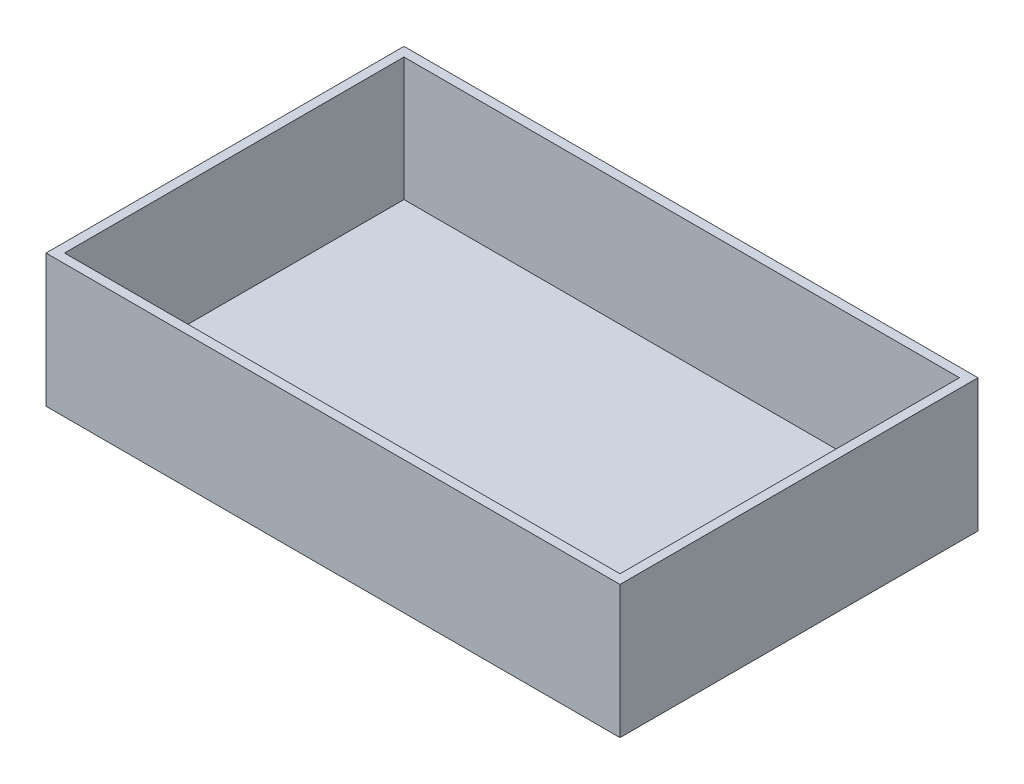
ISO-10303-21;
HEADER;
FILE_DESCRIPTION(('STEP AP214'),'2;1');
FILE_NAME('part.step','',(''),(''),'','','');
FILE_SCHEMA(('AUTOMOTIVE_DESIGN { 1 0 10303 214 1 1 1 1 }'));
ENDSEC;
DATA;
#1=APPLICATION_CONTEXT('core data for automotive mechanical design processes');
#2=APPLICATION_PROTOCOL_DEFINITION('international standard','automotive_design',2000,#1);
#3=PRODUCT_CONTEXT('',#1,'mechanical');
#4=PRODUCT('Part','Part','',(#3));
#5=PRODUCT_RELATED_PRODUCT_CATEGORY('part','',(#4));
#6=PRODUCT_DEFINITION_FORMATION('','',#4);
#7=PRODUCT_DEFINITION_CONTEXT('part definition',#1,'design');
#8=PRODUCT_DEFINITION('design','',#6,#7);
#9=PRODUCT_DEFINITION_SHAPE('','',#8);
#10=(LENGTH_UNIT() NAMED_UNIT(*) SI_UNIT(.MILLI.,.METRE.));
#11=(NAMED_UNIT(*) PLANE_ANGLE_UNIT() SI_UNIT($,.RADIAN.));
#12=(NAMED_UNIT(*) SI_UNIT($,.STERADIAN.) SOLID_ANGLE_UNIT());
#13=UNCERTAINTY_MEASURE_WITH_UNIT(LENGTH_MEASURE(1.E-05),#10,'distance_accuracy_value','');
#14=(GEOMETRIC_REPRESENTATION_CONTEXT(3) GLOBAL_UNCERTAINTY_ASSIGNED_CONTEXT((#13)) GLOBAL_UNIT_ASSIGNED_CONTEXT((#10,
#11,#12)) REPRESENTATION_CONTEXT('',''));
#15=CARTESIAN_POINT('',(0.,0.,0.));
#16=DIRECTION('',(0.,0.,1.));
#17=DIRECTION('',(1.,0.,0.));
#18=AXIS2_PLACEMENT_3D('',#15,#16,#17);
#19=CARTESIAN_POINT('',(-91.3904717390176,20.,-62.8050611790879));
#20=DIRECTION('',(1.,0.,0.));
#21=DIRECTION('',(0.,0.,-1.));
#22=AXIS2_PLACEMENT_3D('',#19,#20,#21);
#23=PLANE('',#22);
#24=DIRECTION('',(0.,0.,1.));
#25=VECTOR('',#24,1.);
#26=CARTESIAN_POINT('',(-91.3904717390176,-1.5,-62.8050611790879));
#27=LINE('',#26,#25);
#28=CARTESIAN_POINT('',(-91.3904717390176,-1.5,-64.3050611790879));
#29=VERTEX_POINT('',#28);
#30=CARTESIAN_POINT('',(-91.3904717390176,-1.5,-6.30506117908789));
#31=VERTEX_POINT('',#30);
#32=EDGE_CURVE('E122',#29,#31,#27,.T.);
#33=ORIENTED_EDGE('',*,*,#32,.T.);
#34=DIRECTION('',(0.,-1.,0.));
#35=VECTOR('',#34,1.);
#36=CARTESIAN_POINT('',(-91.3904717390176,20.,-6.30506117908789));
#37=LINE('',#36,#35);
#38=CARTESIAN_POINT('',(-91.3904717390176,20.,-6.30506117908789));
#39=VERTEX_POINT('',#38);
#40=EDGE_CURVE('E11',#39,#31,#37,.T.);
#41=ORIENTED_EDGE('',*,*,#40,.F.);
#42=DIRECTION('',(0.,0.,1.));
#43=VECTOR('',#42,1.);
#44=CARTESIAN_POINT('',(-91.3904717390176,20.,-62.8050611790879));
#45=LINE('',#44,#43);
#46=CARTESIAN_POINT('',(-91.3904717390176,20.,-64.3050611790879));
#47=VERTEX_POINT('',#46);
#48=EDGE_CURVE('E159',#47,#39,#45,.T.);
#49=ORIENTED_EDGE('',*,*,#48,.F.);
#50=DIRECTION('',(0.,-1.,0.));
#51=VECTOR('',#50,1.);
#52=CARTESIAN_POINT('',(-91.3904717390176,20.,-64.3050611790879));
#53=LINE('',#52,#51);
#54=EDGE_CURVE('E60',#47,#29,#53,.T.);
#55=ORIENTED_EDGE('',*,*,#54,.T.);
#56=EDGE_LOOP('',(#33,#41,#49,#55));
#57=FACE_BOUND('',#56,.T.);
#58=ADVANCED_FACE('F35',(#57),#23,.F.);
#59=CARTESIAN_POINT('',(-89.8904717390176,20.,-6.30506117908789));
#60=DIRECTION('',(0.,0.,-1.));
#61=DIRECTION('',(-1.,0.,0.));
#62=AXIS2_PLACEMENT_3D('',#59,#60,#61);
#63=PLANE('',#62);
#64=DIRECTION('',(1.,0.,0.));
#65=VECTOR('',#64,1.);
#66=CARTESIAN_POINT('',(-89.8904717390176,-1.5,-6.30506117908789));
#67=LINE('',#66,#65);
#68=CARTESIAN_POINT('',(1.60952826098243,-1.5,-6.30506117908789));
#69=VERTEX_POINT('',#68);
#70=EDGE_CURVE('E145',#31,#69,#67,.T.);
#71=ORIENTED_EDGE('',*,*,#70,.T.);
#72=DIRECTION('',(0.,-1.,0.));
#73=VECTOR('',#72,1.);
#74=CARTESIAN_POINT('',(1.60952826098243,20.,-6.30506117908789));
#75=LINE('',#74,#73);
#76=CARTESIAN_POINT('',(1.60952826098243,20.,-6.30506117908789));
#77=VERTEX_POINT('',#76);
#78=EDGE_CURVE('E44',#77,#69,#75,.T.);
#79=ORIENTED_EDGE('',*,*,#78,.F.);
#80=DIRECTION('',(1.,0.,0.));
#81=VECTOR('',#80,1.);
#82=CARTESIAN_POINT('',(-89.8904717390176,20.,-6.30506117908789));
#83=LINE('',#82,#81);
#84=EDGE_CURVE('E162',#39,#77,#83,.T.);
#85=ORIENTED_EDGE('',*,*,#84,.F.);
#86=ORIENTED_EDGE('',*,*,#40,.T.);
#87=EDGE_LOOP('',(#71,#79,#85,#86));
#88=FACE_BOUND('',#87,.T.);
#89=ADVANCED_FACE('F173',(#88),#63,.F.);
#90=CARTESIAN_POINT('',(1.60952826098243,20.,-62.8050611790879));
#91=DIRECTION('',(1.,0.,0.));
#92=DIRECTION('',(0.,0.,-1.));
#93=AXIS2_PLACEMENT_3D('',#90,#91,#92);
#94=PLANE('',#93);
#95=DIRECTION('',(0.,0.,1.));
#96=VECTOR('',#95,1.);
#97=CARTESIAN_POINT('',(1.60952826098243,-1.5,-62.8050611790879));
#98=LINE('',#97,#96);
#99=CARTESIAN_POINT('',(1.60952826098243,-1.5,-64.3050611790879));
#100=VERTEX_POINT('',#99);
#101=EDGE_CURVE('E151',#100,#69,#98,.T.);
#102=ORIENTED_EDGE('',*,*,#101,.F.);
#103=DIRECTION('',(0.,-1.,0.));
#104=VECTOR('',#103,1.);
#105=CARTESIAN_POINT('',(1.60952826098243,20.,-64.3050611790879));
#106=LINE('',#105,#104);
#107=CARTESIAN_POINT('',(1.60952826098243,20.,-64.3050611790879));
#108=VERTEX_POINT('',#107);
#109=EDGE_CURVE('E148',#108,#100,#106,.T.);
#110=ORIENTED_EDGE('',*,*,#109,.F.);
#111=DIRECTION('',(0.,0.,1.));
#112=VECTOR('',#111,1.);
#113=CARTESIAN_POINT('',(1.60952826098243,20.,-62.8050611790879));
#114=LINE('',#113,#112);
#115=EDGE_CURVE('E163',#108,#77,#114,.T.);
#116=ORIENTED_EDGE('',*,*,#115,.T.);
#117=ORIENTED_EDGE('',*,*,#78,.T.);
#118=EDGE_LOOP('',(#102,#110,#116,#117));
#119=FACE_BOUND('',#118,.T.);
#120=ADVANCED_FACE('F174',(#119),#94,.T.);
#121=CARTESIAN_POINT('',(-89.8904717390176,20.,-64.3050611790879));
#122=DIRECTION('',(0.,0.,-1.));
#123=DIRECTION('',(-1.,0.,0.));
#124=AXIS2_PLACEMENT_3D('',#121,#122,#123);
#125=PLANE('',#124);
#126=DIRECTION('',(1.,0.,0.));
#127=VECTOR('',#126,1.);
#128=CARTESIAN_POINT('',(-89.8904717390176,-1.5,-64.3050611790879));
#129=LINE('',#128,#127);
#130=EDGE_CURVE('E155',#29,#100,#129,.T.);
#131=ORIENTED_EDGE('',*,*,#130,.F.);
#132=ORIENTED_EDGE('',*,*,#54,.F.);
#133=DIRECTION('',(1.,0.,0.));
#134=VECTOR('',#133,1.);
#135=CARTESIAN_POINT('',(-89.8904717390176,20.,-64.3050611790879));
#136=LINE('',#135,#134);
#137=EDGE_CURVE('E39',#47,#108,#136,.T.);
#138=ORIENTED_EDGE('',*,*,#137,.T.);
#139=ORIENTED_EDGE('',*,*,#109,.T.);
#140=EDGE_LOOP('',(#131,#132,#138,#139));
#141=FACE_BOUND('',#140,.T.);
#142=ADVANCED_FACE('F168',(#141),#125,.T.);
#143=CARTESIAN_POINT('',(0.,20.,0.));
#144=DIRECTION('',(0.,1.,0.));
#145=DIRECTION('',(0.,0.,1.));
#146=AXIS2_PLACEMENT_3D('',#143,#144,#145);
#147=PLANE('',#146);
#148=DIRECTION('',(0.,0.,1.));
#149=VECTOR('',#148,1.);
#150=CARTESIAN_POINT('',(-89.8904717390176,20.,-62.8050611790879));
#151=LINE('',#150,#149);
#152=CARTESIAN_POINT('',(-89.8904717390176,20.,-62.8050611790879));
#153=VERTEX_POINT('',#152);
#154=CARTESIAN_POINT('',(-89.8904717390176,20.,-7.80506117908789));
#155=VERTEX_POINT('',#154);
#156=EDGE_CURVE('E104',#153,#155,#151,.T.);
#157=ORIENTED_EDGE('',*,*,#156,.F.);
#158=DIRECTION('',(1.,0.,0.));
#159=VECTOR('',#158,1.);
#160=CARTESIAN_POINT('',(-89.8904717390176,20.,-62.8050611790879));
#161=LINE('',#160,#159);
#162=CARTESIAN_POINT('',(0.109528260982428,20.,-62.8050611790879));
#163=VERTEX_POINT('',#162);
#164=EDGE_CURVE('E128',#153,#163,#161,.T.);
#165=ORIENTED_EDGE('',*,*,#164,.T.);
#166=DIRECTION('',(0.,0.,1.));
#167=VECTOR('',#166,1.);
#168=CARTESIAN_POINT('',(0.109528260982428,20.,-62.8050611790879));
#169=LINE('',#168,#167);
#170=CARTESIAN_POINT('',(0.109528260982428,20.,-7.80506117908789));
#171=VERTEX_POINT('',#170);
#172=EDGE_CURVE('E52',#163,#171,#169,.T.);
#173=ORIENTED_EDGE('',*,*,#172,.T.);
#174=DIRECTION('',(1.,0.,0.));
#175=VECTOR('',#174,1.);
#176=CARTESIAN_POINT('',(-89.8904717390176,20.,-7.80506117908789));
#177=LINE('',#176,#175);
#178=EDGE_CURVE('E115',#155,#171,#177,.T.);
#179=ORIENTED_EDGE('',*,*,#178,.F.);
#180=EDGE_LOOP('',(#157,#165,#173,#179));
#181=FACE_BOUND('',#180,.T.);
#182=ORIENTED_EDGE('',*,*,#48,.T.);
#183=ORIENTED_EDGE('',*,*,#84,.T.);
#184=ORIENTED_EDGE('',*,*,#115,.F.);
#185=ORIENTED_EDGE('',*,*,#137,.F.);
#186=EDGE_LOOP('',(#182,#183,#184,#185));
#187=FACE_BOUND('',#186,.T.);
#188=ADVANCED_FACE('F125',(#181,#187),#147,.T.);
#189=CARTESIAN_POINT('',(0.,-1.5,0.));
#190=DIRECTION('',(0.,1.,0.));
#191=DIRECTION('',(0.,0.,1.));
#192=AXIS2_PLACEMENT_3D('',#189,#190,#191);
#193=PLANE('',#192);
#194=ORIENTED_EDGE('',*,*,#32,.F.);
#195=ORIENTED_EDGE('',*,*,#130,.T.);
#196=ORIENTED_EDGE('',*,*,#101,.T.);
#197=ORIENTED_EDGE('',*,*,#70,.F.);
#198=EDGE_LOOP('',(#194,#195,#196,#197));
#199=FACE_BOUND('',#198,.T.);
#200=ADVANCED_FACE('F37',(#199),#193,.F.);
#201=CARTESIAN_POINT('',(-89.8904717390176,20.,-62.8050611790879));
#202=DIRECTION('',(1.,0.,0.));
#203=DIRECTION('',(0.,0.,-1.));
#204=AXIS2_PLACEMENT_3D('',#201,#202,#203);
#205=PLANE('',#204);
#206=DIRECTION('',(0.,0.,1.));
#207=VECTOR('',#206,1.);
#208=CARTESIAN_POINT('',(-89.8904717390176,0.,-62.8050611790879));
#209=LINE('',#208,#207);
#210=CARTESIAN_POINT('',(-89.8904717390176,0.,-62.8050611790879));
#211=VERTEX_POINT('',#210);
#212=CARTESIAN_POINT('',(-89.8904717390176,0.,-7.80506117908789));
#213=VERTEX_POINT('',#212);
#214=EDGE_CURVE('E132',#211,#213,#209,.T.);
#215=ORIENTED_EDGE('',*,*,#214,.F.);
#216=DIRECTION('',(0.,-1.,0.));
#217=VECTOR('',#216,1.);
#218=CARTESIAN_POINT('',(-89.8904717390176,20.,-62.8050611790879));
#219=LINE('',#218,#217);
#220=EDGE_CURVE('E110',#153,#211,#219,.T.);
#221=ORIENTED_EDGE('',*,*,#220,.F.);
#222=ORIENTED_EDGE('',*,*,#156,.T.);
#223=DIRECTION('',(0.,-1.,0.));
#224=VECTOR('',#223,1.);
#225=CARTESIAN_POINT('',(-89.8904717390176,20.,-7.80506117908789));
#226=LINE('',#225,#224);
#227=EDGE_CURVE('E108',#155,#213,#226,.T.);
#228=ORIENTED_EDGE('',*,*,#227,.T.);
#229=EDGE_LOOP('',(#215,#221,#222,#228));
#230=FACE_BOUND('',#229,.T.);
#231=ADVANCED_FACE('F107',(#230),#205,.T.);
#232=CARTESIAN_POINT('',(-89.8904717390176,20.,-7.80506117908789));
#233=DIRECTION('',(0.,0.,-1.));
#234=DIRECTION('',(-1.,0.,0.));
#235=AXIS2_PLACEMENT_3D('',#232,#233,#234);
#236=PLANE('',#235);
#237=DIRECTION('',(1.,0.,0.));
#238=VECTOR('',#237,1.);
#239=CARTESIAN_POINT('',(-89.8904717390176,0.,-7.80506117908789));
#240=LINE('',#239,#238);
#241=CARTESIAN_POINT('',(0.109528260982428,0.,-7.80506117908789));
#242=VERTEX_POINT('',#241);
#243=EDGE_CURVE('E121',#213,#242,#240,.T.);
#244=ORIENTED_EDGE('',*,*,#243,.F.);
#245=ORIENTED_EDGE('',*,*,#227,.F.);
#246=ORIENTED_EDGE('',*,*,#178,.T.);
#247=DIRECTION('',(0.,-1.,0.));
#248=VECTOR('',#247,1.);
#249=CARTESIAN_POINT('',(0.109528260982428,20.,-7.80506117908789));
#250=LINE('',#249,#248);
#251=EDGE_CURVE('E123',#171,#242,#250,.T.);
#252=ORIENTED_EDGE('',*,*,#251,.T.);
#253=EDGE_LOOP('',(#244,#245,#246,#252));
#254=FACE_BOUND('',#253,.T.);
#255=ADVANCED_FACE('F119',(#254),#236,.T.);
#256=CARTESIAN_POINT('',(0.109528260982428,20.,-62.8050611790879));
#257=DIRECTION('',(1.,0.,0.));
#258=DIRECTION('',(0.,0.,-1.));
#259=AXIS2_PLACEMENT_3D('',#256,#257,#258);
#260=PLANE('',#259);
#261=DIRECTION('',(0.,0.,1.));
#262=VECTOR('',#261,1.);
#263=CARTESIAN_POINT('',(0.109528260982428,0.,-62.8050611790879));
#264=LINE('',#263,#262);
#265=CARTESIAN_POINT('',(0.109528260982428,0.,-62.8050611790879));
#266=VERTEX_POINT('',#265);
#267=EDGE_CURVE('E135',#266,#242,#264,.T.);
#268=ORIENTED_EDGE('',*,*,#267,.T.);
#269=ORIENTED_EDGE('',*,*,#251,.F.);
#270=ORIENTED_EDGE('',*,*,#172,.F.);
#271=DIRECTION('',(0.,-1.,0.));
#272=VECTOR('',#271,1.);
#273=CARTESIAN_POINT('',(0.109528260982428,20.,-62.8050611790879));
#274=LINE('',#273,#272);
#275=EDGE_CURVE('E141',#163,#266,#274,.T.);
#276=ORIENTED_EDGE('',*,*,#275,.T.);
#277=EDGE_LOOP('',(#268,#269,#270,#276));
#278=FACE_BOUND('',#277,.T.);
#279=ADVANCED_FACE('F201',(#278),#260,.F.);
#280=CARTESIAN_POINT('',(-89.8904717390176,20.,-62.8050611790879));
#281=DIRECTION('',(0.,0.,-1.));
#282=DIRECTION('',(-1.,0.,0.));
#283=AXIS2_PLACEMENT_3D('',#280,#281,#282);
#284=PLANE('',#283);
#285=DIRECTION('',(1.,0.,0.));
#286=VECTOR('',#285,1.);
#287=CARTESIAN_POINT('',(-89.8904717390176,0.,-62.8050611790879));
#288=LINE('',#287,#286);
#289=EDGE_CURVE('E116',#211,#266,#288,.T.);
#290=ORIENTED_EDGE('',*,*,#289,.T.);
#291=ORIENTED_EDGE('',*,*,#275,.F.);
#292=ORIENTED_EDGE('',*,*,#164,.F.);
#293=ORIENTED_EDGE('',*,*,#220,.T.);
#294=EDGE_LOOP('',(#290,#291,#292,#293));
#295=FACE_BOUND('',#294,.T.);
#296=ADVANCED_FACE('F206',(#295),#284,.F.);
#297=CARTESIAN_POINT('',(0.,0.,0.));
#298=DIRECTION('',(0.,1.,0.));
#299=DIRECTION('',(0.,0.,1.));
#300=AXIS2_PLACEMENT_3D('',#297,#298,#299);
#301=PLANE('',#300);
#302=ORIENTED_EDGE('',*,*,#214,.T.);
#303=ORIENTED_EDGE('',*,*,#243,.T.);
#304=ORIENTED_EDGE('',*,*,#267,.F.);
#305=ORIENTED_EDGE('',*,*,#289,.F.);
#306=EDGE_LOOP('',(#302,#303,#304,#305));
#307=FACE_BOUND('',#306,.T.);
#308=ADVANCED_FACE('F209',(#307),#301,.T.);
#309=CLOSED_SHELL('',(#58,#89,#120,#142,#188,#200,#231,#255,#279,#296,#308));
#310=MANIFOLD_SOLID_BREP('B2',#309);
#311=ADVANCED_BREP_SHAPE_REPRESENTATION('',(#18,#310),#14);
#312=SHAPE_DEFINITION_REPRESENTATION(#9,#311);
ENDSEC;
END-ISO-10303-21;
